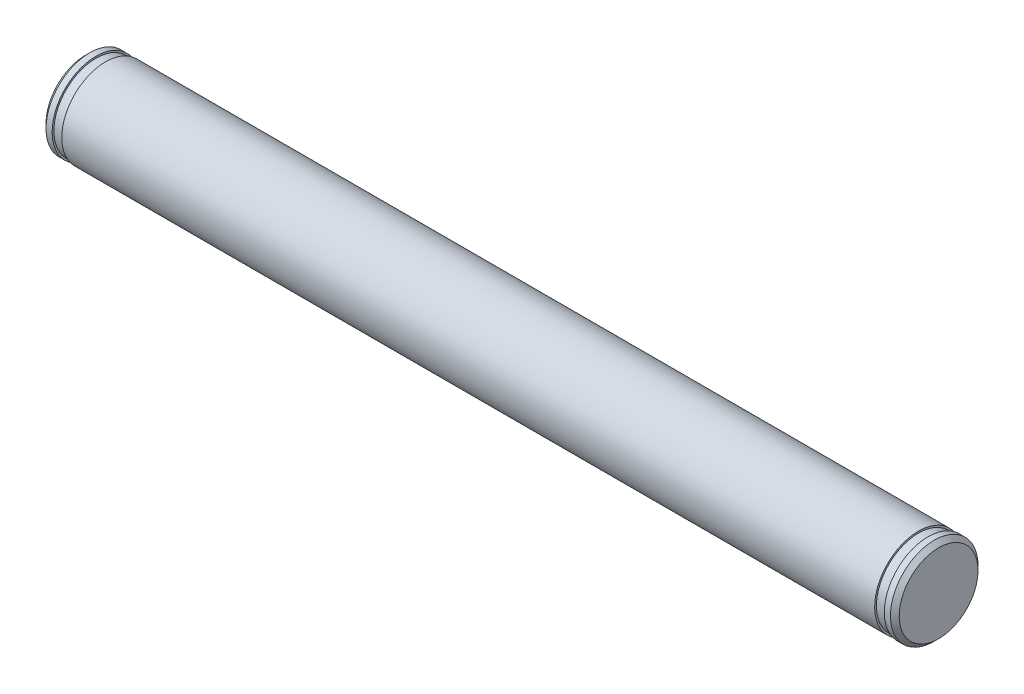
ISO-10303-21;
HEADER;
FILE_DESCRIPTION(('STEP AP214'),'2;1');
FILE_NAME('part.step','',(''),(''),'','','');
FILE_SCHEMA(('AUTOMOTIVE_DESIGN { 1 0 10303 214 1 1 1 1 }'));
ENDSEC;
DATA;
#1=APPLICATION_CONTEXT('core data for automotive mechanical design processes');
#2=APPLICATION_PROTOCOL_DEFINITION('international standard','automotive_design',2000,#1);
#3=PRODUCT_CONTEXT('',#1,'mechanical');
#4=PRODUCT('Part','Part','',(#3));
#5=PRODUCT_RELATED_PRODUCT_CATEGORY('part','',(#4));
#6=PRODUCT_DEFINITION_FORMATION('','',#4);
#7=PRODUCT_DEFINITION_CONTEXT('part definition',#1,'design');
#8=PRODUCT_DEFINITION('design','',#6,#7);
#9=PRODUCT_DEFINITION_SHAPE('','',#8);
#10=(LENGTH_UNIT() NAMED_UNIT(*) SI_UNIT(.MILLI.,.METRE.));
#11=(NAMED_UNIT(*) PLANE_ANGLE_UNIT() SI_UNIT($,.RADIAN.));
#12=(NAMED_UNIT(*) SI_UNIT($,.STERADIAN.) SOLID_ANGLE_UNIT());
#13=UNCERTAINTY_MEASURE_WITH_UNIT(LENGTH_MEASURE(1.E-05),#10,'distance_accuracy_value','');
#14=(GEOMETRIC_REPRESENTATION_CONTEXT(3) GLOBAL_UNCERTAINTY_ASSIGNED_CONTEXT((#13)) GLOBAL_UNIT_ASSIGNED_CONTEXT((#10,
#11,#12)) REPRESENTATION_CONTEXT('',''));
#15=CARTESIAN_POINT('',(0.,0.,0.));
#16=DIRECTION('',(0.,0.,1.));
#17=DIRECTION('',(1.,0.,0.));
#18=AXIS2_PLACEMENT_3D('',#15,#16,#17);
#19=CARTESIAN_POINT('',(-48.7,0.,0.));
#20=DIRECTION('',(-1.,0.,0.));
#21=DIRECTION('',(0.,-1.,0.));
#22=AXIS2_PLACEMENT_3D('',#19,#20,#21);
#23=PLANE('',#22);
#24=CARTESIAN_POINT('',(-48.7,0.,0.));
#25=DIRECTION('',(-1.,0.,0.));
#26=DIRECTION('',(0.,-1.,0.));
#27=AXIS2_PLACEMENT_3D('',#24,#25,#26);
#28=CIRCLE('',#27,4.49999999999999);
#29=CARTESIAN_POINT('',(-48.7,-4.49999999999999,0.));
#30=VERTEX_POINT('',#29);
#31=EDGE_CURVE('E10',#30,#30,#28,.T.);
#32=ORIENTED_EDGE('',*,*,#31,.T.);
#33=EDGE_LOOP('',(#32));
#34=FACE_BOUND('',#33,.T.);
#35=ADVANCED_FACE('F39',(#34),#23,.T.);
#36=CARTESIAN_POINT('',(48.7,0.,0.));
#37=DIRECTION('',(1.,0.,0.));
#38=DIRECTION('',(0.,1.,0.));
#39=AXIS2_PLACEMENT_3D('',#36,#37,#38);
#40=CYLINDRICAL_SURFACE('',#39,4.99999999999999);
#41=CARTESIAN_POINT('',(-48.2,0.,0.));
#42=DIRECTION('',(-1.,0.,0.));
#43=DIRECTION('',(0.,-1.,0.));
#44=AXIS2_PLACEMENT_3D('',#41,#42,#43);
#45=CIRCLE('',#44,4.99999999999999);
#46=CARTESIAN_POINT('',(-48.2,-4.99999999999999,0.));
#47=VERTEX_POINT('',#46);
#48=EDGE_CURVE('E48',#47,#47,#45,.F.);
#49=ORIENTED_EDGE('',*,*,#48,.T.);
#50=EDGE_LOOP('',(#49));
#51=FACE_BOUND('',#50,.T.);
#52=CARTESIAN_POINT('',(-47.5,0.,0.));
#53=DIRECTION('',(1.,0.,0.));
#54=DIRECTION('',(0.,1.,0.));
#55=AXIS2_PLACEMENT_3D('',#52,#53,#54);
#56=CIRCLE('',#55,4.99999999999999);
#57=CARTESIAN_POINT('',(-47.5,4.99999999999999,0.));
#58=VERTEX_POINT('',#57);
#59=EDGE_CURVE('E64',#58,#58,#56,.T.);
#60=ORIENTED_EDGE('',*,*,#59,.F.);
#61=EDGE_LOOP('',(#60));
#62=FACE_BOUND('',#61,.T.);
#63=ADVANCED_FACE('F115',(#51,#62),#40,.T.);
#64=CARTESIAN_POINT('',(-47.5,4.99999999999999,0.));
#65=DIRECTION('',(1.,0.,0.));
#66=DIRECTION('',(0.,1.,0.));
#67=AXIS2_PLACEMENT_3D('',#64,#65,#66);
#68=PLANE('',#67);
#69=ORIENTED_EDGE('',*,*,#59,.T.);
#70=EDGE_LOOP('',(#69));
#71=FACE_BOUND('',#70,.T.);
#72=CARTESIAN_POINT('',(-47.5,0.,0.));
#73=DIRECTION('',(1.,0.,0.));
#74=DIRECTION('',(0.,1.,0.));
#75=AXIS2_PLACEMENT_3D('',#72,#73,#74);
#76=CIRCLE('',#75,4.79999999999999);
#77=CARTESIAN_POINT('',(-47.5,4.79999999999999,0.));
#78=VERTEX_POINT('',#77);
#79=EDGE_CURVE('E68',#78,#78,#76,.T.);
#80=ORIENTED_EDGE('',*,*,#79,.F.);
#81=EDGE_LOOP('',(#80));
#82=FACE_BOUND('',#81,.T.);
#83=ADVANCED_FACE('F120',(#71,#82),#68,.T.);
#84=CARTESIAN_POINT('',(48.7,0.,0.));
#85=DIRECTION('',(1.,0.,0.));
#86=DIRECTION('',(0.,1.,0.));
#87=AXIS2_PLACEMENT_3D('',#84,#85,#86);
#88=CYLINDRICAL_SURFACE('',#87,4.79999999999999);
#89=ORIENTED_EDGE('',*,*,#79,.T.);
#90=EDGE_LOOP('',(#89));
#91=FACE_BOUND('',#90,.T.);
#92=CARTESIAN_POINT('',(-46.4,0.,0.));
#93=DIRECTION('',(1.,0.,0.));
#94=DIRECTION('',(0.,1.,0.));
#95=AXIS2_PLACEMENT_3D('',#92,#93,#94);
#96=CIRCLE('',#95,4.79999999999999);
#97=CARTESIAN_POINT('',(-46.4,4.79999999999999,0.));
#98=VERTEX_POINT('',#97);
#99=EDGE_CURVE('E72',#98,#98,#96,.T.);
#100=ORIENTED_EDGE('',*,*,#99,.F.);
#101=EDGE_LOOP('',(#100));
#102=FACE_BOUND('',#101,.T.);
#103=ADVANCED_FACE('F196',(#91,#102),#88,.T.);
#104=CARTESIAN_POINT('',(-46.4,4.79999999999999,0.));
#105=DIRECTION('',(-1.,0.,0.));
#106=DIRECTION('',(0.,-1.,0.));
#107=AXIS2_PLACEMENT_3D('',#104,#105,#106);
#108=PLANE('',#107);
#109=ORIENTED_EDGE('',*,*,#99,.T.);
#110=EDGE_LOOP('',(#109));
#111=FACE_BOUND('',#110,.T.);
#112=CARTESIAN_POINT('',(-46.4,0.,0.));
#113=DIRECTION('',(1.,0.,0.));
#114=DIRECTION('',(0.,1.,0.));
#115=AXIS2_PLACEMENT_3D('',#112,#113,#114);
#116=CIRCLE('',#115,4.99999999999999);
#117=CARTESIAN_POINT('',(-46.4,4.99999999999999,0.));
#118=VERTEX_POINT('',#117);
#119=EDGE_CURVE('E76',#118,#118,#116,.T.);
#120=ORIENTED_EDGE('',*,*,#119,.F.);
#121=EDGE_LOOP('',(#120));
#122=FACE_BOUND('',#121,.T.);
#123=ADVANCED_FACE('F186',(#111,#122),#108,.T.);
#124=CARTESIAN_POINT('',(48.7,0.,0.));
#125=DIRECTION('',(1.,0.,0.));
#126=DIRECTION('',(0.,1.,0.));
#127=AXIS2_PLACEMENT_3D('',#124,#125,#126);
#128=CYLINDRICAL_SURFACE('',#127,4.99999999999999);
#129=ORIENTED_EDGE('',*,*,#119,.T.);
#130=EDGE_LOOP('',(#129));
#131=FACE_BOUND('',#130,.T.);
#132=CARTESIAN_POINT('',(46.4,0.,0.));
#133=DIRECTION('',(1.,0.,0.));
#134=DIRECTION('',(0.,1.,0.));
#135=AXIS2_PLACEMENT_3D('',#132,#133,#134);
#136=CIRCLE('',#135,4.99999999999999);
#137=CARTESIAN_POINT('',(46.4,5.,0.));
#138=VERTEX_POINT('',#137);
#139=EDGE_CURVE('E80',#138,#138,#136,.T.);
#140=ORIENTED_EDGE('',*,*,#139,.F.);
#141=EDGE_LOOP('',(#140));
#142=FACE_BOUND('',#141,.T.);
#143=ADVANCED_FACE('F176',(#131,#142),#128,.T.);
#144=CARTESIAN_POINT('',(46.4,4.8,0.));
#145=DIRECTION('',(1.,0.,0.));
#146=DIRECTION('',(0.,1.,0.));
#147=AXIS2_PLACEMENT_3D('',#144,#145,#146);
#148=PLANE('',#147);
#149=ORIENTED_EDGE('',*,*,#139,.T.);
#150=EDGE_LOOP('',(#149));
#151=FACE_BOUND('',#150,.T.);
#152=CARTESIAN_POINT('',(46.4,0.,0.));
#153=DIRECTION('',(1.,0.,0.));
#154=DIRECTION('',(0.,1.,0.));
#155=AXIS2_PLACEMENT_3D('',#152,#153,#154);
#156=CIRCLE('',#155,4.79999999999999);
#157=CARTESIAN_POINT('',(46.4,4.8,0.));
#158=VERTEX_POINT('',#157);
#159=EDGE_CURVE('E84',#158,#158,#156,.T.);
#160=ORIENTED_EDGE('',*,*,#159,.F.);
#161=EDGE_LOOP('',(#160));
#162=FACE_BOUND('',#161,.T.);
#163=ADVANCED_FACE('F111',(#151,#162),#148,.T.);
#164=CARTESIAN_POINT('',(48.7,0.,0.));
#165=DIRECTION('',(1.,0.,0.));
#166=DIRECTION('',(0.,1.,0.));
#167=AXIS2_PLACEMENT_3D('',#164,#165,#166);
#168=CYLINDRICAL_SURFACE('',#167,4.79999999999999);
#169=ORIENTED_EDGE('',*,*,#159,.T.);
#170=EDGE_LOOP('',(#169));
#171=FACE_BOUND('',#170,.T.);
#172=CARTESIAN_POINT('',(47.5,0.,0.));
#173=DIRECTION('',(1.,0.,0.));
#174=DIRECTION('',(0.,1.,0.));
#175=AXIS2_PLACEMENT_3D('',#172,#173,#174);
#176=CIRCLE('',#175,4.79999999999999);
#177=CARTESIAN_POINT('',(47.5,4.8,0.));
#178=VERTEX_POINT('',#177);
#179=EDGE_CURVE('E88',#178,#178,#176,.T.);
#180=ORIENTED_EDGE('',*,*,#179,.F.);
#181=EDGE_LOOP('',(#180));
#182=FACE_BOUND('',#181,.T.);
#183=ADVANCED_FACE('F101',(#171,#182),#168,.T.);
#184=CARTESIAN_POINT('',(47.5,5.,0.));
#185=DIRECTION('',(-1.,0.,0.));
#186=DIRECTION('',(0.,-1.,0.));
#187=AXIS2_PLACEMENT_3D('',#184,#185,#186);
#188=PLANE('',#187);
#189=ORIENTED_EDGE('',*,*,#179,.T.);
#190=EDGE_LOOP('',(#189));
#191=FACE_BOUND('',#190,.T.);
#192=CARTESIAN_POINT('',(47.5,0.,0.));
#193=DIRECTION('',(1.,0.,0.));
#194=DIRECTION('',(0.,1.,0.));
#195=AXIS2_PLACEMENT_3D('',#192,#193,#194);
#196=CIRCLE('',#195,4.99999999999999);
#197=CARTESIAN_POINT('',(47.5,5.,0.));
#198=VERTEX_POINT('',#197);
#199=EDGE_CURVE('E92',#198,#198,#196,.T.);
#200=ORIENTED_EDGE('',*,*,#199,.F.);
#201=EDGE_LOOP('',(#200));
#202=FACE_BOUND('',#201,.T.);
#203=ADVANCED_FACE('F99',(#191,#202),#188,.T.);
#204=CARTESIAN_POINT('',(48.7,0.,0.));
#205=DIRECTION('',(1.,0.,0.));
#206=DIRECTION('',(0.,1.,0.));
#207=AXIS2_PLACEMENT_3D('',#204,#205,#206);
#208=CYLINDRICAL_SURFACE('',#207,4.99999999999999);
#209=CARTESIAN_POINT('',(48.2,0.,0.));
#210=DIRECTION('',(1.,0.,0.));
#211=DIRECTION('',(0.,1.,0.));
#212=AXIS2_PLACEMENT_3D('',#209,#210,#211);
#213=CIRCLE('',#212,4.99999999999999);
#214=CARTESIAN_POINT('',(48.2,5.,0.));
#215=VERTEX_POINT('',#214);
#216=EDGE_CURVE('E53',#215,#215,#213,.F.);
#217=ORIENTED_EDGE('',*,*,#216,.T.);
#218=EDGE_LOOP('',(#217));
#219=FACE_BOUND('',#218,.T.);
#220=ORIENTED_EDGE('',*,*,#199,.T.);
#221=EDGE_LOOP('',(#220));
#222=FACE_BOUND('',#221,.T.);
#223=ADVANCED_FACE('F97',(#219,#222),#208,.T.);
#224=CARTESIAN_POINT('',(48.7,0.,0.));
#225=DIRECTION('',(1.,0.,0.));
#226=DIRECTION('',(0.,1.,0.));
#227=AXIS2_PLACEMENT_3D('',#224,#225,#226);
#228=PLANE('',#227);
#229=CARTESIAN_POINT('',(48.7,0.,0.));
#230=DIRECTION('',(1.,0.,0.));
#231=DIRECTION('',(0.,1.,0.));
#232=AXIS2_PLACEMENT_3D('',#229,#230,#231);
#233=CIRCLE('',#232,4.49999999999999);
#234=CARTESIAN_POINT('',(48.7,4.5,0.));
#235=VERTEX_POINT('',#234);
#236=EDGE_CURVE('E58',#235,#235,#233,.T.);
#237=ORIENTED_EDGE('',*,*,#236,.T.);
#238=EDGE_LOOP('',(#237));
#239=FACE_BOUND('',#238,.T.);
#240=ADVANCED_FACE('F108',(#239),#228,.T.);
#241=CARTESIAN_POINT('',(48.7,0.,0.));
#242=DIRECTION('',(-1.,0.,0.));
#243=DIRECTION('',(0.,-1.,0.));
#244=AXIS2_PLACEMENT_3D('',#241,#242,#243);
#245=CONICAL_SURFACE('',#244,4.49999999999999,0.785398163397447);
#246=ORIENTED_EDGE('',*,*,#216,.F.);
#247=EDGE_LOOP('',(#246));
#248=FACE_BOUND('',#247,.T.);
#249=ORIENTED_EDGE('',*,*,#236,.F.);
#250=EDGE_LOOP('',(#249));
#251=FACE_BOUND('',#250,.T.);
#252=ADVANCED_FACE('F124',(#248,#251),#245,.T.);
#253=CARTESIAN_POINT('',(-48.2,0.,0.));
#254=DIRECTION('',(1.,0.,0.));
#255=DIRECTION('',(0.,1.,0.));
#256=AXIS2_PLACEMENT_3D('',#253,#254,#255);
#257=CONICAL_SURFACE('',#256,4.99999999999999,0.785398163397447);
#258=ORIENTED_EDGE('',*,*,#31,.F.);
#259=EDGE_LOOP('',(#258));
#260=FACE_BOUND('',#259,.T.);
#261=ORIENTED_EDGE('',*,*,#48,.F.);
#262=EDGE_LOOP('',(#261));
#263=FACE_BOUND('',#262,.T.);
#264=ADVANCED_FACE('F42',(#260,#263),#257,.T.);
#265=CLOSED_SHELL('',(#35,#63,#83,#103,#123,#143,#163,#183,#203,#223,#240,#252,#264));
#266=MANIFOLD_SOLID_BREP('B2',#265);
#267=ADVANCED_BREP_SHAPE_REPRESENTATION('',(#18,#266),#14);
#268=SHAPE_DEFINITION_REPRESENTATION(#9,#267);
ENDSEC;
END-ISO-10303-21;
